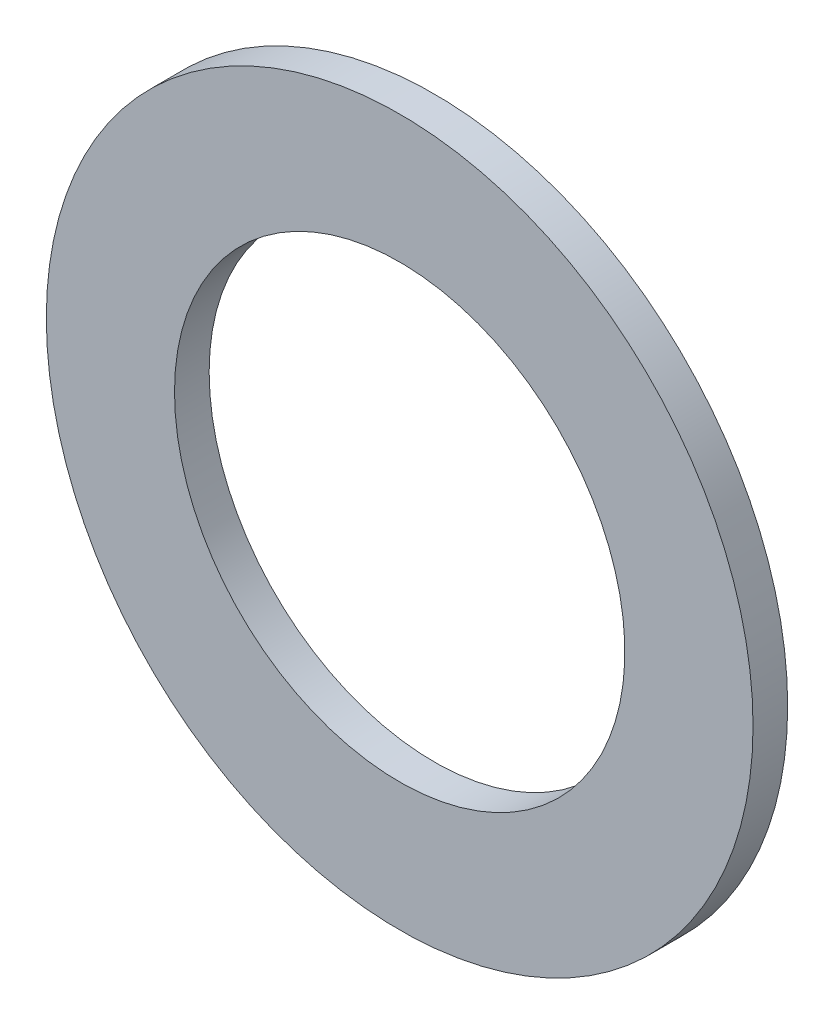
ISO-10303-21;
HEADER;
FILE_DESCRIPTION(('STEP AP214'),'2;1');
FILE_NAME('part.step','',(''),(''),'','','');
FILE_SCHEMA(('AUTOMOTIVE_DESIGN { 1 0 10303 214 1 1 1 1 }'));
ENDSEC;
DATA;
#1=APPLICATION_CONTEXT('core data for automotive mechanical design processes');
#2=APPLICATION_PROTOCOL_DEFINITION('international standard','automotive_design',2000,#1);
#3=PRODUCT_CONTEXT('',#1,'mechanical');
#4=PRODUCT('Part','Part','',(#3));
#5=PRODUCT_RELATED_PRODUCT_CATEGORY('part','',(#4));
#6=PRODUCT_DEFINITION_FORMATION('','',#4);
#7=PRODUCT_DEFINITION_CONTEXT('part definition',#1,'design');
#8=PRODUCT_DEFINITION('design','',#6,#7);
#9=PRODUCT_DEFINITION_SHAPE('','',#8);
#10=(LENGTH_UNIT() NAMED_UNIT(*) SI_UNIT(.MILLI.,.METRE.));
#11=(NAMED_UNIT(*) PLANE_ANGLE_UNIT() SI_UNIT($,.RADIAN.));
#12=(NAMED_UNIT(*) SI_UNIT($,.STERADIAN.) SOLID_ANGLE_UNIT());
#13=UNCERTAINTY_MEASURE_WITH_UNIT(LENGTH_MEASURE(1.E-05),#10,'distance_accuracy_value','');
#14=(GEOMETRIC_REPRESENTATION_CONTEXT(3) GLOBAL_UNCERTAINTY_ASSIGNED_CONTEXT((#13)) GLOBAL_UNIT_ASSIGNED_CONTEXT((#10,
#11,#12)) REPRESENTATION_CONTEXT('',''));
#15=CARTESIAN_POINT('',(0.,0.,0.));
#16=DIRECTION('',(0.,0.,1.));
#17=DIRECTION('',(1.,0.,0.));
#18=AXIS2_PLACEMENT_3D('',#15,#16,#17);
#19=CARTESIAN_POINT('',(0.,0.,0.));
#20=DIRECTION('',(0.,0.,1.));
#21=DIRECTION('',(1.,0.,0.));
#22=AXIS2_PLACEMENT_3D('',#19,#20,#21);
#23=PLANE('',#22);
#24=CARTESIAN_POINT('',(0.,0.,0.));
#25=DIRECTION('',(0.,0.,-1.));
#26=DIRECTION('',(-1.,0.,0.));
#27=AXIS2_PLACEMENT_3D('',#24,#25,#26);
#28=CIRCLE('',#27,5.1);
#29=CARTESIAN_POINT('',(-5.1,0.,0.));
#30=VERTEX_POINT('',#29);
#31=EDGE_CURVE('E27',#30,#30,#28,.F.);
#32=ORIENTED_EDGE('',*,*,#31,.F.);
#33=EDGE_LOOP('',(#32));
#34=FACE_BOUND('',#33,.T.);
#35=CARTESIAN_POINT('',(0.,0.,0.));
#36=DIRECTION('',(0.,0.,-1.));
#37=DIRECTION('',(-1.,0.,0.));
#38=AXIS2_PLACEMENT_3D('',#35,#36,#37);
#39=CIRCLE('',#38,3.25);
#40=CARTESIAN_POINT('',(-3.25,0.,0.));
#41=VERTEX_POINT('',#40);
#42=EDGE_CURVE('E18',#41,#41,#39,.F.);
#43=ORIENTED_EDGE('',*,*,#42,.T.);
#44=EDGE_LOOP('',(#43));
#45=FACE_BOUND('',#44,.T.);
#46=ADVANCED_FACE('F15',(#34,#45),#23,.F.);
#47=CARTESIAN_POINT('',(0.,0.,0.5));
#48=DIRECTION('',(0.,0.,-1.));
#49=DIRECTION('',(-1.,0.,0.));
#50=AXIS2_PLACEMENT_3D('',#47,#48,#49);
#51=CYLINDRICAL_SURFACE('',#50,3.25);
#52=CARTESIAN_POINT('',(0.,0.,0.5));
#53=DIRECTION('',(0.,0.,-1.));
#54=DIRECTION('',(-1.,0.,0.));
#55=AXIS2_PLACEMENT_3D('',#52,#53,#54);
#56=CIRCLE('',#55,3.25);
#57=CARTESIAN_POINT('',(-3.25,0.,0.5));
#58=VERTEX_POINT('',#57);
#59=EDGE_CURVE('E22',#58,#58,#56,.T.);
#60=ORIENTED_EDGE('',*,*,#59,.F.);
#61=EDGE_LOOP('',(#60));
#62=FACE_BOUND('',#61,.T.);
#63=ORIENTED_EDGE('',*,*,#42,.F.);
#64=EDGE_LOOP('',(#63));
#65=FACE_BOUND('',#64,.T.);
#66=ADVANCED_FACE('F36',(#62,#65),#51,.F.);
#67=CARTESIAN_POINT('',(0.,0.,0.5));
#68=DIRECTION('',(0.,0.,-1.));
#69=DIRECTION('',(-1.,0.,0.));
#70=AXIS2_PLACEMENT_3D('',#67,#68,#69);
#71=CYLINDRICAL_SURFACE('',#70,5.1);
#72=ORIENTED_EDGE('',*,*,#31,.T.);
#73=EDGE_LOOP('',(#72));
#74=FACE_BOUND('',#73,.T.);
#75=CARTESIAN_POINT('',(0.,0.,0.5));
#76=DIRECTION('',(0.,0.,-1.));
#77=DIRECTION('',(-1.,0.,0.));
#78=AXIS2_PLACEMENT_3D('',#75,#76,#77);
#79=CIRCLE('',#78,5.1);
#80=CARTESIAN_POINT('',(-5.1,0.,0.5));
#81=VERTEX_POINT('',#80);
#82=EDGE_CURVE('E10',#81,#81,#79,.F.);
#83=ORIENTED_EDGE('',*,*,#82,.F.);
#84=EDGE_LOOP('',(#83));
#85=FACE_BOUND('',#84,.T.);
#86=ADVANCED_FACE('F38',(#74,#85),#71,.T.);
#87=CARTESIAN_POINT('',(0.,0.,0.5));
#88=DIRECTION('',(0.,0.,1.));
#89=DIRECTION('',(1.,0.,0.));
#90=AXIS2_PLACEMENT_3D('',#87,#88,#89);
#91=PLANE('',#90);
#92=ORIENTED_EDGE('',*,*,#82,.T.);
#93=EDGE_LOOP('',(#92));
#94=FACE_BOUND('',#93,.T.);
#95=ORIENTED_EDGE('',*,*,#59,.T.);
#96=EDGE_LOOP('',(#95));
#97=FACE_BOUND('',#96,.T.);
#98=ADVANCED_FACE('F45',(#94,#97),#91,.T.);
#99=CLOSED_SHELL('',(#46,#66,#86,#98));
#100=MANIFOLD_SOLID_BREP('B1',#99);
#101=ADVANCED_BREP_SHAPE_REPRESENTATION('',(#18,#100),#14);
#102=SHAPE_DEFINITION_REPRESENTATION(#9,#101);
ENDSEC;
END-ISO-10303-21;
